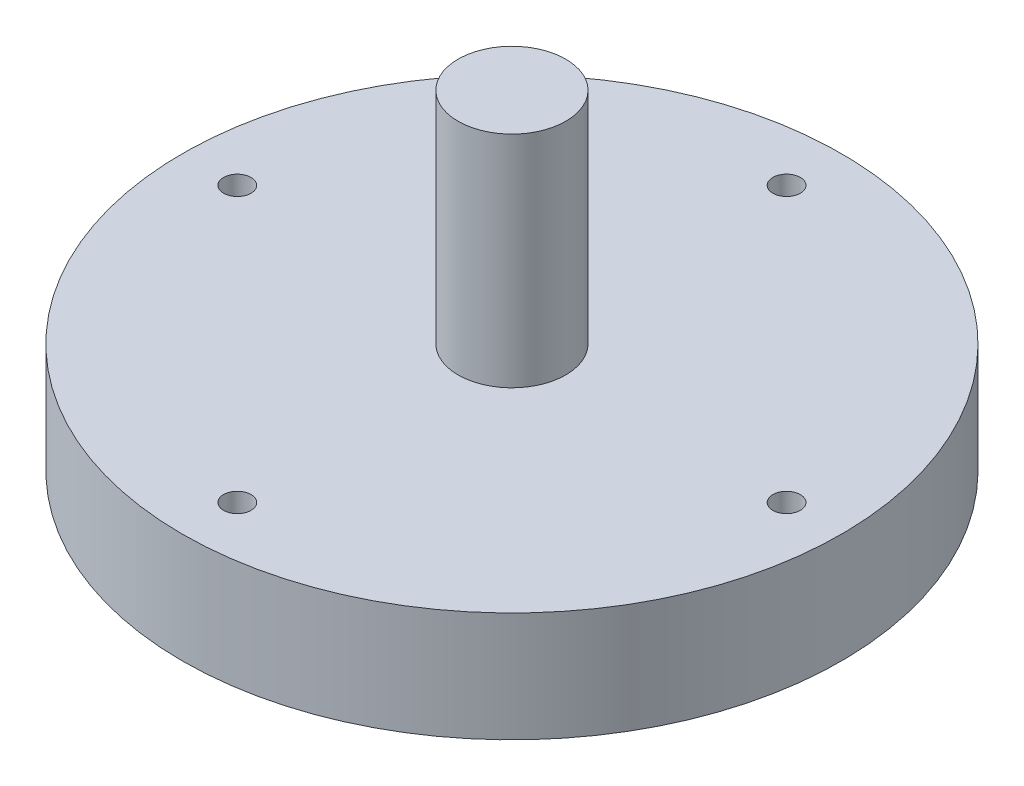
ISO-10303-21;
HEADER;
FILE_DESCRIPTION(('STEP AP214'),'2;1');
FILE_NAME('part.step','',(''),(''),'','','');
FILE_SCHEMA(('AUTOMOTIVE_DESIGN { 1 0 10303 214 1 1 1 1 }'));
ENDSEC;
DATA;
#1=APPLICATION_CONTEXT('core data for automotive mechanical design processes');
#2=APPLICATION_PROTOCOL_DEFINITION('international standard','automotive_design',2000,#1);
#3=PRODUCT_CONTEXT('',#1,'mechanical');
#4=PRODUCT('Part','Part','',(#3));
#5=PRODUCT_RELATED_PRODUCT_CATEGORY('part','',(#4));
#6=PRODUCT_DEFINITION_FORMATION('','',#4);
#7=PRODUCT_DEFINITION_CONTEXT('part definition',#1,'design');
#8=PRODUCT_DEFINITION('design','',#6,#7);
#9=PRODUCT_DEFINITION_SHAPE('','',#8);
#10=(LENGTH_UNIT() NAMED_UNIT(*) SI_UNIT(.MILLI.,.METRE.));
#11=(NAMED_UNIT(*) PLANE_ANGLE_UNIT() SI_UNIT($,.RADIAN.));
#12=(NAMED_UNIT(*) SI_UNIT($,.STERADIAN.) SOLID_ANGLE_UNIT());
#13=UNCERTAINTY_MEASURE_WITH_UNIT(LENGTH_MEASURE(1.E-05),#10,'distance_accuracy_value','');
#14=(GEOMETRIC_REPRESENTATION_CONTEXT(3) GLOBAL_UNCERTAINTY_ASSIGNED_CONTEXT((#13)) GLOBAL_UNIT_ASSIGNED_CONTEXT((#10,
#11,#12)) REPRESENTATION_CONTEXT('',''));
#15=CARTESIAN_POINT('',(0.,0.,0.));
#16=DIRECTION('',(0.,0.,1.));
#17=DIRECTION('',(1.,0.,0.));
#18=AXIS2_PLACEMENT_3D('',#15,#16,#17);
#19=CARTESIAN_POINT('',(0.,12.7,0.));
#20=DIRECTION('',(0.,-1.,0.));
#21=DIRECTION('',(0.,0.,-1.));
#22=AXIS2_PLACEMENT_3D('',#19,#20,#21);
#23=CYLINDRICAL_SURFACE('',#22,38.1);
#24=CARTESIAN_POINT('',(0.,12.7,0.));
#25=DIRECTION('',(0.,1.,0.));
#26=DIRECTION('',(0.,0.,1.));
#27=AXIS2_PLACEMENT_3D('',#24,#25,#26);
#28=CIRCLE('',#27,38.1);
#29=CARTESIAN_POINT('',(0.,12.7,38.1));
#30=VERTEX_POINT('',#29);
#31=EDGE_CURVE('E38',#30,#30,#28,.T.);
#32=ORIENTED_EDGE('',*,*,#31,.F.);
#33=EDGE_LOOP('',(#32));
#34=FACE_BOUND('',#33,.T.);
#35=CARTESIAN_POINT('',(0.,0.,0.));
#36=DIRECTION('',(0.,1.,0.));
#37=DIRECTION('',(0.,0.,1.));
#38=AXIS2_PLACEMENT_3D('',#35,#36,#37);
#39=CIRCLE('',#38,38.1);
#40=CARTESIAN_POINT('',(0.,0.,38.1));
#41=VERTEX_POINT('',#40);
#42=EDGE_CURVE('E34',#41,#41,#39,.T.);
#43=ORIENTED_EDGE('',*,*,#42,.T.);
#44=EDGE_LOOP('',(#43));
#45=FACE_BOUND('',#44,.T.);
#46=ADVANCED_FACE('F31',(#34,#45),#23,.T.);
#47=CARTESIAN_POINT('',(0.,12.7,0.));
#48=DIRECTION('',(0.,1.,0.));
#49=DIRECTION('',(0.,0.,1.));
#50=AXIS2_PLACEMENT_3D('',#47,#48,#49);
#51=PLANE('',#50);
#52=CARTESIAN_POINT('',(-31.75,12.7,1.10530556274716E-13));
#53=DIRECTION('',(0.,1.,0.));
#54=DIRECTION('',(1.,0.,0.));
#55=AXIS2_PLACEMENT_3D('',#52,#53,#54);
#56=CIRCLE('',#55,1.5875);
#57=CARTESIAN_POINT('',(-30.1625,12.7,1.04987829649303E-13));
#58=VERTEX_POINT('',#57);
#59=EDGE_CURVE('E66',#58,#58,#56,.T.);
#60=ORIENTED_EDGE('',*,*,#59,.F.);
#61=EDGE_LOOP('',(#60));
#62=FACE_BOUND('',#61,.T.);
#63=CARTESIAN_POINT('',(0.,12.7,31.75));
#64=DIRECTION('',(0.,1.,0.));
#65=DIRECTION('',(0.,0.,-1.));
#66=AXIS2_PLACEMENT_3D('',#63,#64,#65);
#67=CIRCLE('',#66,1.5875);
#68=CARTESIAN_POINT('',(0.,12.7,30.1625));
#69=VERTEX_POINT('',#68);
#70=EDGE_CURVE('E60',#69,#69,#67,.T.);
#71=ORIENTED_EDGE('',*,*,#70,.F.);
#72=EDGE_LOOP('',(#71));
#73=FACE_BOUND('',#72,.T.);
#74=CARTESIAN_POINT('',(31.75,12.7,-3.32239621291255E-13));
#75=DIRECTION('',(0.,1.,0.));
#76=DIRECTION('',(-1.,0.,0.));
#77=AXIS2_PLACEMENT_3D('',#74,#75,#76);
#78=CIRCLE('',#77,1.5875);
#79=CARTESIAN_POINT('',(30.1625,12.7,-3.15611441415015E-13));
#80=VERTEX_POINT('',#79);
#81=EDGE_CURVE('E54',#80,#80,#78,.T.);
#82=ORIENTED_EDGE('',*,*,#81,.F.);
#83=EDGE_LOOP('',(#82));
#84=FACE_BOUND('',#83,.T.);
#85=CARTESIAN_POINT('',(0.,12.7,-31.75));
#86=DIRECTION('',(0.,1.,0.));
#87=DIRECTION('',(0.,0.,1.));
#88=AXIS2_PLACEMENT_3D('',#85,#86,#87);
#89=CIRCLE('',#88,1.5875);
#90=CARTESIAN_POINT('',(0.,12.7,-30.1625));
#91=VERTEX_POINT('',#90);
#92=EDGE_CURVE('E48',#91,#91,#89,.T.);
#93=ORIENTED_EDGE('',*,*,#92,.F.);
#94=EDGE_LOOP('',(#93));
#95=FACE_BOUND('',#94,.T.);
#96=CARTESIAN_POINT('',(0.,12.7,0.));
#97=DIRECTION('',(0.,1.,0.));
#98=DIRECTION('',(0.,0.,1.));
#99=AXIS2_PLACEMENT_3D('',#96,#97,#98);
#100=CIRCLE('',#99,6.223);
#101=CARTESIAN_POINT('',(0.,12.7,6.223));
#102=VERTEX_POINT('',#101);
#103=EDGE_CURVE('E10',#102,#102,#100,.T.);
#104=ORIENTED_EDGE('',*,*,#103,.F.);
#105=EDGE_LOOP('',(#104));
#106=FACE_BOUND('',#105,.T.);
#107=ORIENTED_EDGE('',*,*,#31,.T.);
#108=EDGE_LOOP('',(#107));
#109=FACE_BOUND('',#108,.T.);
#110=ADVANCED_FACE('F82',(#62,#73,#84,#95,#106,#109),#51,.T.);
#111=CARTESIAN_POINT('',(0.,0.,0.));
#112=DIRECTION('',(0.,1.,0.));
#113=DIRECTION('',(0.,0.,1.));
#114=AXIS2_PLACEMENT_3D('',#111,#112,#113);
#115=PLANE('',#114);
#116=CARTESIAN_POINT('',(-31.75,0.,1.10530556274716E-13));
#117=DIRECTION('',(0.,1.,0.));
#118=DIRECTION('',(1.,0.,0.));
#119=AXIS2_PLACEMENT_3D('',#116,#117,#118);
#120=CIRCLE('',#119,1.5875);
#121=CARTESIAN_POINT('',(-30.1625,0.,1.04987829649303E-13));
#122=VERTEX_POINT('',#121);
#123=EDGE_CURVE('E51',#122,#122,#120,.T.);
#124=ORIENTED_EDGE('',*,*,#123,.T.);
#125=EDGE_LOOP('',(#124));
#126=FACE_BOUND('',#125,.T.);
#127=CARTESIAN_POINT('',(0.,0.,31.75));
#128=DIRECTION('',(0.,1.,0.));
#129=DIRECTION('',(0.,0.,-1.));
#130=AXIS2_PLACEMENT_3D('',#127,#128,#129);
#131=CIRCLE('',#130,1.5875);
#132=CARTESIAN_POINT('',(0.,0.,30.1625));
#133=VERTEX_POINT('',#132);
#134=EDGE_CURVE('E63',#133,#133,#131,.T.);
#135=ORIENTED_EDGE('',*,*,#134,.T.);
#136=EDGE_LOOP('',(#135));
#137=FACE_BOUND('',#136,.T.);
#138=CARTESIAN_POINT('',(31.75,0.,-3.32239621291255E-13));
#139=DIRECTION('',(0.,1.,0.));
#140=DIRECTION('',(-1.,0.,0.));
#141=AXIS2_PLACEMENT_3D('',#138,#139,#140);
#142=CIRCLE('',#141,1.5875);
#143=CARTESIAN_POINT('',(30.1625,0.,-3.15611441415015E-13));
#144=VERTEX_POINT('',#143);
#145=EDGE_CURVE('E57',#144,#144,#142,.T.);
#146=ORIENTED_EDGE('',*,*,#145,.T.);
#147=EDGE_LOOP('',(#146));
#148=FACE_BOUND('',#147,.T.);
#149=CARTESIAN_POINT('',(0.,0.,-31.75));
#150=DIRECTION('',(0.,1.,0.));
#151=DIRECTION('',(0.,0.,1.));
#152=AXIS2_PLACEMENT_3D('',#149,#150,#151);
#153=CIRCLE('',#152,1.5875);
#154=CARTESIAN_POINT('',(0.,0.,-30.1625));
#155=VERTEX_POINT('',#154);
#156=EDGE_CURVE('E47',#155,#155,#153,.T.);
#157=ORIENTED_EDGE('',*,*,#156,.T.);
#158=EDGE_LOOP('',(#157));
#159=FACE_BOUND('',#158,.T.);
#160=ORIENTED_EDGE('',*,*,#42,.F.);
#161=EDGE_LOOP('',(#160));
#162=FACE_BOUND('',#161,.T.);
#163=ADVANCED_FACE('F72',(#126,#137,#148,#159,#162),#115,.F.);
#164=CARTESIAN_POINT('',(0.,38.1,0.));
#165=DIRECTION('',(0.,-1.,0.));
#166=DIRECTION('',(0.,0.,-1.));
#167=AXIS2_PLACEMENT_3D('',#164,#165,#166);
#168=CYLINDRICAL_SURFACE('',#167,6.223);
#169=CARTESIAN_POINT('',(0.,38.1,0.));
#170=DIRECTION('',(0.,1.,0.));
#171=DIRECTION('',(0.,0.,1.));
#172=AXIS2_PLACEMENT_3D('',#169,#170,#171);
#173=CIRCLE('',#172,6.223);
#174=CARTESIAN_POINT('',(0.,38.1,6.223));
#175=VERTEX_POINT('',#174);
#176=EDGE_CURVE('E44',#175,#175,#173,.T.);
#177=ORIENTED_EDGE('',*,*,#176,.F.);
#178=EDGE_LOOP('',(#177));
#179=FACE_BOUND('',#178,.T.);
#180=ORIENTED_EDGE('',*,*,#103,.T.);
#181=EDGE_LOOP('',(#180));
#182=FACE_BOUND('',#181,.T.);
#183=ADVANCED_FACE('F101',(#179,#182),#168,.T.);
#184=CARTESIAN_POINT('',(0.,38.1,0.));
#185=DIRECTION('',(0.,1.,0.));
#186=DIRECTION('',(0.,0.,1.));
#187=AXIS2_PLACEMENT_3D('',#184,#185,#186);
#188=PLANE('',#187);
#189=ORIENTED_EDGE('',*,*,#176,.T.);
#190=EDGE_LOOP('',(#189));
#191=FACE_BOUND('',#190,.T.);
#192=ADVANCED_FACE('F105',(#191),#188,.T.);
#193=CARTESIAN_POINT('',(0.,0.,-31.75));
#194=DIRECTION('',(0.,1.,0.));
#195=DIRECTION('',(0.,0.,1.));
#196=AXIS2_PLACEMENT_3D('',#193,#194,#195);
#197=CYLINDRICAL_SURFACE('',#196,1.5875);
#198=ORIENTED_EDGE('',*,*,#156,.F.);
#199=EDGE_LOOP('',(#198));
#200=FACE_BOUND('',#199,.T.);
#201=ORIENTED_EDGE('',*,*,#92,.T.);
#202=EDGE_LOOP('',(#201));
#203=FACE_BOUND('',#202,.T.);
#204=ADVANCED_FACE('F111',(#200,#203),#197,.F.);
#205=CARTESIAN_POINT('',(31.75,0.,-3.32239621291255E-13));
#206=DIRECTION('',(0.,1.,0.));
#207=DIRECTION('',(0.,0.,1.));
#208=AXIS2_PLACEMENT_3D('',#205,#206,#207);
#209=CYLINDRICAL_SURFACE('',#208,1.5875);
#210=ORIENTED_EDGE('',*,*,#145,.F.);
#211=EDGE_LOOP('',(#210));
#212=FACE_BOUND('',#211,.T.);
#213=ORIENTED_EDGE('',*,*,#81,.T.);
#214=EDGE_LOOP('',(#213));
#215=FACE_BOUND('',#214,.T.);
#216=ADVANCED_FACE('F115',(#212,#215),#209,.F.);
#217=CARTESIAN_POINT('',(0.,0.,31.75));
#218=DIRECTION('',(0.,1.,0.));
#219=DIRECTION('',(0.,0.,1.));
#220=AXIS2_PLACEMENT_3D('',#217,#218,#219);
#221=CYLINDRICAL_SURFACE('',#220,1.5875);
#222=ORIENTED_EDGE('',*,*,#134,.F.);
#223=EDGE_LOOP('',(#222));
#224=FACE_BOUND('',#223,.T.);
#225=ORIENTED_EDGE('',*,*,#70,.T.);
#226=EDGE_LOOP('',(#225));
#227=FACE_BOUND('',#226,.T.);
#228=ADVANCED_FACE('F78',(#224,#227),#221,.F.);
#229=CARTESIAN_POINT('',(-31.75,0.,1.10530556274716E-13));
#230=DIRECTION('',(0.,1.,0.));
#231=DIRECTION('',(0.,0.,1.));
#232=AXIS2_PLACEMENT_3D('',#229,#230,#231);
#233=CYLINDRICAL_SURFACE('',#232,1.5875);
#234=ORIENTED_EDGE('',*,*,#123,.F.);
#235=EDGE_LOOP('',(#234));
#236=FACE_BOUND('',#235,.T.);
#237=ORIENTED_EDGE('',*,*,#59,.T.);
#238=EDGE_LOOP('',(#237));
#239=FACE_BOUND('',#238,.T.);
#240=ADVANCED_FACE('F75',(#236,#239),#233,.F.);
#241=CLOSED_SHELL('',(#46,#110,#163,#183,#192,#204,#216,#228,#240));
#242=MANIFOLD_SOLID_BREP('B2',#241);
#243=ADVANCED_BREP_SHAPE_REPRESENTATION('',(#18,#242),#14);
#244=SHAPE_DEFINITION_REPRESENTATION(#9,#243);
ENDSEC;
END-ISO-10303-21;
